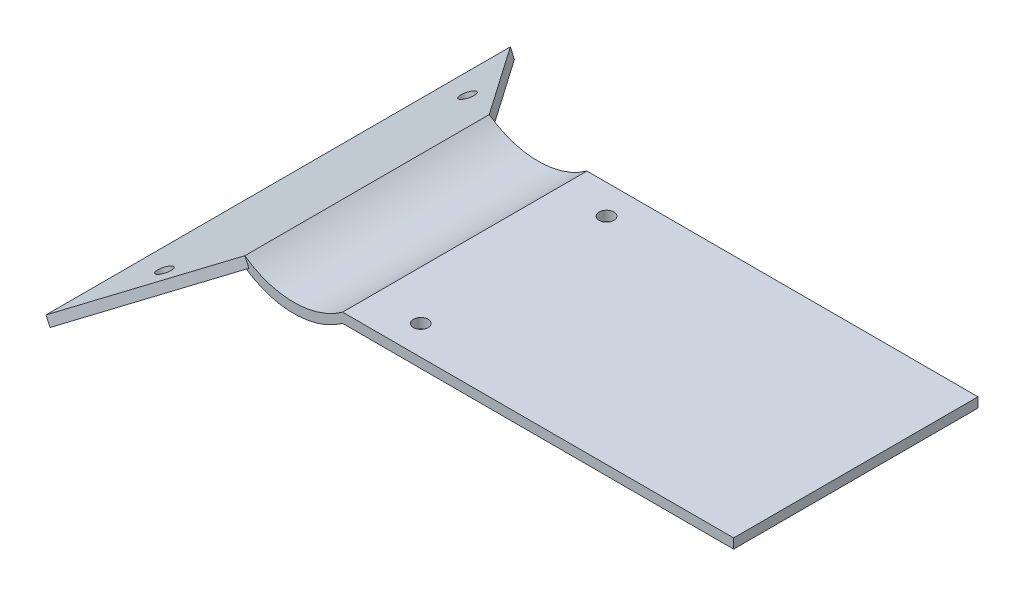
ISO-10303-21;
HEADER;
FILE_DESCRIPTION(('STEP AP214'),'2;1');
FILE_NAME('part.step','',(''),(''),'','','');
FILE_SCHEMA(('AUTOMOTIVE_DESIGN { 1 0 10303 214 1 1 1 1 }'));
ENDSEC;
DATA;
#1=APPLICATION_CONTEXT('core data for automotive mechanical design processes');
#2=APPLICATION_PROTOCOL_DEFINITION('international standard','automotive_design',2000,#1);
#3=PRODUCT_CONTEXT('',#1,'mechanical');
#4=PRODUCT('Part','Part','',(#3));
#5=PRODUCT_RELATED_PRODUCT_CATEGORY('part','',(#4));
#6=PRODUCT_DEFINITION_FORMATION('','',#4);
#7=PRODUCT_DEFINITION_CONTEXT('part definition',#1,'design');
#8=PRODUCT_DEFINITION('design','',#6,#7);
#9=PRODUCT_DEFINITION_SHAPE('','',#8);
#10=(LENGTH_UNIT() NAMED_UNIT(*) SI_UNIT(.MILLI.,.METRE.));
#11=(NAMED_UNIT(*) PLANE_ANGLE_UNIT() SI_UNIT($,.RADIAN.));
#12=(NAMED_UNIT(*) SI_UNIT($,.STERADIAN.) SOLID_ANGLE_UNIT());
#13=UNCERTAINTY_MEASURE_WITH_UNIT(LENGTH_MEASURE(1.E-05),#10,'distance_accuracy_value','');
#14=(GEOMETRIC_REPRESENTATION_CONTEXT(3) GLOBAL_UNCERTAINTY_ASSIGNED_CONTEXT((#13)) GLOBAL_UNIT_ASSIGNED_CONTEXT((#10,
#11,#12)) REPRESENTATION_CONTEXT('',''));
#15=CARTESIAN_POINT('',(0.,0.,0.));
#16=DIRECTION('',(0.,0.,1.));
#17=DIRECTION('',(1.,0.,0.));
#18=AXIS2_PLACEMENT_3D('',#15,#16,#17);
#19=CARTESIAN_POINT('',(-215.409015853351,9.9999999999999,500.));
#20=DIRECTION('',(0.,-1.,0.));
#21=DIRECTION('',(1.,0.,0.));
#22=AXIS2_PLACEMENT_3D('',#19,#20,#21);
#23=PLANE('',#22);
#24=CARTESIAN_POINT('',(-300.,9.99999999999989,60.));
#25=DIRECTION('',(0.,1.,0.));
#26=DIRECTION('',(-1.,0.,0.));
#27=AXIS2_PLACEMENT_3D('',#24,#25,#26);
#28=CIRCLE('',#27,15.);
#29=CARTESIAN_POINT('',(-315.,9.99999999999989,60.));
#30=VERTEX_POINT('',#29);
#31=EDGE_CURVE('E175',#30,#30,#28,.T.);
#32=ORIENTED_EDGE('',*,*,#31,.F.);
#33=EDGE_LOOP('',(#32));
#34=FACE_BOUND('',#33,.T.);
#35=DIRECTION('',(-1.,0.,0.));
#36=VECTOR('',#35,1.);
#37=CARTESIAN_POINT('',(-215.409015853351,9.9999999999999,0.));
#38=LINE('',#37,#36);
#39=CARTESIAN_POINT('',(400.,10.,0.));
#40=VERTEX_POINT('',#39);
#41=CARTESIAN_POINT('',(-400.,9.99999999999988,0.));
#42=VERTEX_POINT('',#41);
#43=EDGE_CURVE('E128',#40,#42,#38,.T.);
#44=ORIENTED_EDGE('',*,*,#43,.T.);
#45=DIRECTION('',(0.,0.,-1.));
#46=VECTOR('',#45,1.);
#47=CARTESIAN_POINT('',(-400.,9.99999999999988,500.));
#48=LINE('',#47,#46);
#49=CARTESIAN_POINT('',(-400.,9.99999999999988,500.));
#50=VERTEX_POINT('',#49);
#51=EDGE_CURVE('E160',#50,#42,#48,.T.);
#52=ORIENTED_EDGE('',*,*,#51,.F.);
#53=DIRECTION('',(-1.,0.,0.));
#54=VECTOR('',#53,1.);
#55=CARTESIAN_POINT('',(-215.409015853351,9.9999999999999,500.));
#56=LINE('',#55,#54);
#57=CARTESIAN_POINT('',(400.,10.,500.));
#58=VERTEX_POINT('',#57);
#59=EDGE_CURVE('E84',#58,#50,#56,.T.);
#60=ORIENTED_EDGE('',*,*,#59,.F.);
#61=DIRECTION('',(0.,0.,-1.));
#62=VECTOR('',#61,1.);
#63=CARTESIAN_POINT('',(400.,10.,500.));
#64=LINE('',#63,#62);
#65=EDGE_CURVE('E123',#58,#40,#64,.T.);
#66=ORIENTED_EDGE('',*,*,#65,.T.);
#67=EDGE_LOOP('',(#44,#52,#60,#66));
#68=FACE_BOUND('',#67,.T.);
#69=CARTESIAN_POINT('',(-300.,9.99999999999989,440.));
#70=DIRECTION('',(0.,1.,0.));
#71=DIRECTION('',(-1.,0.,0.));
#72=AXIS2_PLACEMENT_3D('',#69,#70,#71);
#73=CIRCLE('',#72,15.);
#74=CARTESIAN_POINT('',(-315.,9.99999999999989,440.));
#75=VERTEX_POINT('',#74);
#76=EDGE_CURVE('E165',#75,#75,#73,.F.);
#77=ORIENTED_EDGE('',*,*,#76,.T.);
#78=EDGE_LOOP('',(#77));
#79=FACE_BOUND('',#78,.T.);
#80=ADVANCED_FACE('F33',(#34,#68,#79),#23,.F.);
#81=CARTESIAN_POINT('',(-215.409015853351,-10.,500.));
#82=DIRECTION('',(0.,-1.,0.));
#83=DIRECTION('',(1.,0.,0.));
#84=AXIS2_PLACEMENT_3D('',#81,#82,#83);
#85=PLANE('',#84);
#86=CARTESIAN_POINT('',(-300.,-10.,60.));
#87=DIRECTION('',(0.,-1.,0.));
#88=DIRECTION('',(1.,0.,0.));
#89=AXIS2_PLACEMENT_3D('',#86,#87,#88);
#90=CIRCLE('',#89,15.);
#91=CARTESIAN_POINT('',(-285.,-10.,60.));
#92=VERTEX_POINT('',#91);
#93=EDGE_CURVE('E36',#92,#92,#90,.T.);
#94=ORIENTED_EDGE('',*,*,#93,.F.);
#95=EDGE_LOOP('',(#94));
#96=FACE_BOUND('',#95,.T.);
#97=DIRECTION('',(-1.,0.,0.));
#98=VECTOR('',#97,1.);
#99=CARTESIAN_POINT('',(-215.409015853351,-10.,0.));
#100=LINE('',#99,#98);
#101=CARTESIAN_POINT('',(400.,-9.99999999999993,0.));
#102=VERTEX_POINT('',#101);
#103=CARTESIAN_POINT('',(-400.,-10.,0.));
#104=VERTEX_POINT('',#103);
#105=EDGE_CURVE('E144',#102,#104,#100,.T.);
#106=ORIENTED_EDGE('',*,*,#105,.F.);
#107=DIRECTION('',(0.,0.,-1.));
#108=VECTOR('',#107,1.);
#109=CARTESIAN_POINT('',(400.,-9.99999999999993,500.));
#110=LINE('',#109,#108);
#111=CARTESIAN_POINT('',(400.,-9.99999999999993,500.));
#112=VERTEX_POINT('',#111);
#113=EDGE_CURVE('E75',#112,#102,#110,.T.);
#114=ORIENTED_EDGE('',*,*,#113,.F.);
#115=DIRECTION('',(-1.,0.,0.));
#116=VECTOR('',#115,1.);
#117=CARTESIAN_POINT('',(-215.409015853351,-10.,500.));
#118=LINE('',#117,#116);
#119=CARTESIAN_POINT('',(-400.,-10.,500.));
#120=VERTEX_POINT('',#119);
#121=EDGE_CURVE('E101',#112,#120,#118,.T.);
#122=ORIENTED_EDGE('',*,*,#121,.T.);
#123=DIRECTION('',(0.,0.,-1.));
#124=VECTOR('',#123,1.);
#125=CARTESIAN_POINT('',(-400.,-10.,500.));
#126=LINE('',#125,#124);
#127=EDGE_CURVE('E110',#120,#104,#126,.T.);
#128=ORIENTED_EDGE('',*,*,#127,.T.);
#129=EDGE_LOOP('',(#106,#114,#122,#128));
#130=FACE_BOUND('',#129,.T.);
#131=CARTESIAN_POINT('',(-300.,-10.,440.));
#132=DIRECTION('',(0.,-1.,0.));
#133=DIRECTION('',(1.,0.,0.));
#134=AXIS2_PLACEMENT_3D('',#131,#132,#133);
#135=CIRCLE('',#134,15.);
#136=CARTESIAN_POINT('',(-285.,-10.,440.));
#137=VERTEX_POINT('',#136);
#138=EDGE_CURVE('E162',#137,#137,#135,.F.);
#139=ORIENTED_EDGE('',*,*,#138,.T.);
#140=EDGE_LOOP('',(#139));
#141=FACE_BOUND('',#140,.T.);
#142=ADVANCED_FACE('F120',(#96,#130,#141),#85,.T.);
#143=CARTESIAN_POINT('',(-215.409015853351,-969.886426697641,0.));
#144=DIRECTION('',(0.,0.,1.));
#145=DIRECTION('',(1.,0.,0.));
#146=AXIS2_PLACEMENT_3D('',#143,#144,#145);
#147=PLANE('',#146);
#148=DIRECTION('',(-0.416666666666667,0.909059342886309,0.));
#149=VECTOR('',#148,1.);
#150=CARTESIAN_POINT('',(-773.478535243929,-91.5145201910597,0.));
#151=LINE('',#150,#149);
#152=CARTESIAN_POINT('',(-774.236374053209,-89.8611111111113,0.));
#153=VERTEX_POINT('',#152);
#154=CARTESIAN_POINT('',(-781.811868577262,-73.3333333333335,0.));
#155=VERTEX_POINT('',#154);
#156=EDGE_CURVE('E11',#153,#155,#151,.T.);
#157=ORIENTED_EDGE('',*,*,#156,.F.);
#158=DIRECTION('',(-0.90905934288631,-0.416666666666667,0.));
#159=VECTOR('',#158,1.);
#160=CARTESIAN_POINT('',(-645.759002392385,-30.9736043593051,0.));
#161=LINE('',#160,#159);
#162=CARTESIAN_POINT('',(-818.174242292714,-110.,0.));
#163=VERTEX_POINT('',#162);
#164=EDGE_CURVE('E138',#153,#163,#161,.T.);
#165=ORIENTED_EDGE('',*,*,#164,.T.);
#166=DIRECTION('',(-0.704154339142587,-0.710046946804693,0.));
#167=VECTOR('',#166,1.);
#168=CARTESIAN_POINT('',(-949.231435355701,-242.153925096134,0.));
#169=LINE('',#168,#167);
#170=EDGE_CURVE('E135',#155,#163,#169,.T.);
#171=ORIENTED_EDGE('',*,*,#170,.F.);
#172=EDGE_LOOP('',(#157,#165,#171));
#173=FACE_BOUND('',#172,.T.);
#174=ADVANCED_FACE('F260',(#173),#147,.F.);
#175=DIRECTION('',(-0.909059342886309,-0.416666666666667,0.));
#176=VECTOR('',#175,1.);
#177=CARTESIAN_POINT('',(-1368.37615592177,-364.185397571579,0.));
#178=LINE('',#177,#176);
#179=CARTESIAN_POINT('',(-591.666666666667,-8.18118685772623,0.));
#180=VERTEX_POINT('',#179);
#181=CARTESIAN_POINT('',(-598.299201498949,-11.2212042138465,0.));
#182=VERTEX_POINT('',#181);
#183=EDGE_CURVE('E189',#180,#182,#178,.T.);
#184=ORIENTED_EDGE('',*,*,#183,.F.);
#185=DIRECTION('',(-0.416666666666667,0.909059342886309,0.));
#186=VECTOR('',#185,1.);
#187=CARTESIAN_POINT('',(-591.666666666667,-8.18118685772623,0.));
#188=LINE('',#187,#186);
#189=CARTESIAN_POINT('',(-600.,9.9999999999999,0.));
#190=VERTEX_POINT('',#189);
#191=EDGE_CURVE('E197',#180,#190,#188,.T.);
#192=ORIENTED_EDGE('',*,*,#191,.T.);
#193=CARTESIAN_POINT('',(-500.,147.477270848675,0.));
#194=DIRECTION('',(0.,0.,1.));
#195=DIRECTION('',(1.,0.,0.));
#196=AXIS2_PLACEMENT_3D('',#193,#194,#195);
#197=CIRCLE('',#196,170.);
#198=EDGE_CURVE('E131',#190,#42,#197,.T.);
#199=ORIENTED_EDGE('',*,*,#198,.T.);
#200=ORIENTED_EDGE('',*,*,#43,.F.);
#201=DIRECTION('',(0.,1.,0.));
#202=VECTOR('',#201,1.);
#203=CARTESIAN_POINT('',(400.,-969.886426697641,0.));
#204=LINE('',#203,#202);
#205=EDGE_CURVE('E78',#102,#40,#204,.T.);
#206=ORIENTED_EDGE('',*,*,#205,.F.);
#207=ORIENTED_EDGE('',*,*,#105,.T.);
#208=CARTESIAN_POINT('',(-500.,127.477270848675,0.));
#209=DIRECTION('',(0.,0.,1.));
#210=DIRECTION('',(1.,0.,0.));
#211=AXIS2_PLACEMENT_3D('',#208,#209,#210);
#212=CIRCLE('',#211,170.);
#213=EDGE_CURVE('E114',#182,#104,#212,.T.);
#214=ORIENTED_EDGE('',*,*,#213,.F.);
#215=EDGE_LOOP('',(#184,#192,#199,#200,#206,#207,#214));
#216=FACE_BOUND('',#215,.T.);
#217=ADVANCED_FACE('F308',(#216),#147,.F.);
#218=CARTESIAN_POINT('',(-215.409015853351,-969.886426697641,500.));
#219=DIRECTION('',(0.,0.,1.));
#220=DIRECTION('',(1.,0.,0.));
#221=AXIS2_PLACEMENT_3D('',#218,#219,#220);
#222=PLANE('',#221);
#223=DIRECTION('',(-0.90905934288631,-0.416666666666667,0.));
#224=VECTOR('',#223,1.);
#225=CARTESIAN_POINT('',(-645.759002392385,-30.9736043593051,500.));
#226=LINE('',#225,#224);
#227=CARTESIAN_POINT('',(-774.236374053209,-89.8611111111113,500.));
#228=VERTEX_POINT('',#227);
#229=CARTESIAN_POINT('',(-818.174242292714,-110.,500.));
#230=VERTEX_POINT('',#229);
#231=EDGE_CURVE('E237',#228,#230,#226,.T.);
#232=ORIENTED_EDGE('',*,*,#231,.F.);
#233=DIRECTION('',(-0.416666666666667,0.909059342886309,0.));
#234=VECTOR('',#233,1.);
#235=CARTESIAN_POINT('',(-773.478535243929,-91.5145201910596,500.));
#236=LINE('',#235,#234);
#237=CARTESIAN_POINT('',(-781.811868577262,-73.3333333333335,500.));
#238=VERTEX_POINT('',#237);
#239=EDGE_CURVE('E161',#228,#238,#236,.T.);
#240=ORIENTED_EDGE('',*,*,#239,.T.);
#241=DIRECTION('',(-0.704154339142587,-0.710046946804693,0.));
#242=VECTOR('',#241,1.);
#243=CARTESIAN_POINT('',(-949.231435355701,-242.153925096134,500.));
#244=LINE('',#243,#242);
#245=EDGE_CURVE('E235',#238,#230,#244,.T.);
#246=ORIENTED_EDGE('',*,*,#245,.T.);
#247=EDGE_LOOP('',(#232,#240,#246));
#248=FACE_BOUND('',#247,.T.);
#249=ADVANCED_FACE('F251',(#248),#222,.T.);
#250=CARTESIAN_POINT('',(-500.,147.477270848675,500.));
#251=DIRECTION('',(0.,0.,-1.));
#252=DIRECTION('',(-1.,0.,0.));
#253=AXIS2_PLACEMENT_3D('',#250,#251,#252);
#254=CYLINDRICAL_SURFACE('',#253,170.);
#255=ORIENTED_EDGE('',*,*,#198,.F.);
#256=DIRECTION('',(0.,0.,-1.));
#257=VECTOR('',#256,1.);
#258=CARTESIAN_POINT('',(-600.,9.9999999999999,500.));
#259=LINE('',#258,#257);
#260=CARTESIAN_POINT('',(-600.,9.99999999999995,500.));
#261=VERTEX_POINT('',#260);
#262=EDGE_CURVE('E157',#261,#190,#259,.T.);
#263=ORIENTED_EDGE('',*,*,#262,.F.);
#264=CARTESIAN_POINT('',(-500.,147.477270848675,500.));
#265=DIRECTION('',(0.,0.,1.));
#266=DIRECTION('',(1.,0.,0.));
#267=AXIS2_PLACEMENT_3D('',#264,#265,#266);
#268=CIRCLE('',#267,170.);
#269=EDGE_CURVE('E232',#261,#50,#268,.T.);
#270=ORIENTED_EDGE('',*,*,#269,.T.);
#271=ORIENTED_EDGE('',*,*,#51,.T.);
#272=EDGE_LOOP('',(#255,#263,#270,#271));
#273=FACE_BOUND('',#272,.T.);
#274=ADVANCED_FACE('F382',(#273),#254,.F.);
#275=CARTESIAN_POINT('',(-653.334496916438,-14.4458265815273,500.));
#276=DIRECTION('',(0.416666666666667,-0.909059342886309,0.));
#277=DIRECTION('',(0.909059342886309,0.416666666666667,0.));
#278=AXIS2_PLACEMENT_3D('',#275,#276,#277);
#279=PLANE('',#278);
#280=ORIENTED_EDGE('',*,*,#262,.T.);
#281=DIRECTION('',(-0.603946154764153,-0.276818266179133,-0.74740931868366));
#282=VECTOR('',#281,1.);
#283=CARTESIAN_POINT('',(-813.752809149338,-87.973439441378,-264.52828649172));
#284=LINE('',#283,#282);
#285=CARTESIAN_POINT('',(-781.811868577262,-73.3333333333335,-225.));
#286=VERTEX_POINT('',#285);
#287=EDGE_CURVE('E168',#190,#286,#284,.T.);
#288=ORIENTED_EDGE('',*,*,#287,.T.);
#289=DIRECTION('',(0.,0.,1.));
#290=VECTOR('',#289,1.);
#291=CARTESIAN_POINT('',(-781.811868577262,-73.3333333333335,285.937358889559));
#292=LINE('',#291,#290);
#293=EDGE_CURVE('E182',#286,#155,#292,.T.);
#294=ORIENTED_EDGE('',*,*,#293,.T.);
#295=DIRECTION('',(0.,0.,-1.));
#296=VECTOR('',#295,1.);
#297=CARTESIAN_POINT('',(-781.811868577262,-73.3333333333335,500.));
#298=LINE('',#297,#296);
#299=EDGE_CURVE('E154',#238,#155,#298,.T.);
#300=ORIENTED_EDGE('',*,*,#299,.F.);
#301=DIRECTION('',(0.,0.,-1.));
#302=VECTOR('',#301,1.);
#303=CARTESIAN_POINT('',(-781.811868577262,-73.3333333333336,285.937358889559));
#304=LINE('',#303,#302);
#305=CARTESIAN_POINT('',(-781.811868577262,-73.3333333333335,725.));
#306=VERTEX_POINT('',#305);
#307=EDGE_CURVE('E220',#306,#238,#304,.T.);
#308=ORIENTED_EDGE('',*,*,#307,.F.);
#309=DIRECTION('',(-0.603946154764153,-0.276818266179133,0.74740931868366));
#310=VECTOR('',#309,1.);
#311=CARTESIAN_POINT('',(-846.19669623512,-102.844070706023,804.678990906262));
#312=LINE('',#311,#310);
#313=EDGE_CURVE('E199',#261,#306,#312,.T.);
#314=ORIENTED_EDGE('',*,*,#313,.F.);
#315=EDGE_LOOP('',(#280,#288,#294,#300,#308,#314));
#316=FACE_BOUND('',#315,.T.);
#317=CARTESIAN_POINT('',(-704.541824431926,-37.9166666666667,560.));
#318=DIRECTION('',(-0.416666666666667,0.909059342886309,0.));
#319=DIRECTION('',(-0.909059342886309,-0.416666666666667,0.));
#320=AXIS2_PLACEMENT_3D('',#317,#318,#319);
#321=CIRCLE('',#320,15.0000000000001);
#322=CARTESIAN_POINT('',(-718.17771457522,-44.1666666666668,560.));
#323=VERTEX_POINT('',#322);
#324=EDGE_CURVE('E208',#323,#323,#321,.F.);
#325=ORIENTED_EDGE('',*,*,#324,.T.);
#326=EDGE_LOOP('',(#325));
#327=FACE_BOUND('',#326,.T.);
#328=CARTESIAN_POINT('',(-704.541824431926,-37.9166666666668,-60.));
#329=DIRECTION('',(-0.416666666666667,0.909059342886309,0.));
#330=DIRECTION('',(-0.909059342886309,-0.416666666666667,0.));
#331=AXIS2_PLACEMENT_3D('',#328,#329,#330);
#332=CIRCLE('',#331,15.0000000000001);
#333=CARTESIAN_POINT('',(-718.177714575221,-44.1666666666669,-60.));
#334=VERTEX_POINT('',#333);
#335=EDGE_CURVE('E164',#334,#334,#332,.T.);
#336=ORIENTED_EDGE('',*,*,#335,.F.);
#337=EDGE_LOOP('',(#336));
#338=FACE_BOUND('',#337,.T.);
#339=ADVANCED_FACE('F386',(#316,#327,#338),#279,.F.);
#340=CARTESIAN_POINT('',(-949.231435355701,-242.153925096134,500.));
#341=DIRECTION('',(0.710046946804693,-0.704154339142587,0.));
#342=DIRECTION('',(0.704154339142587,0.710046946804693,0.));
#343=AXIS2_PLACEMENT_3D('',#340,#341,#342);
#344=PLANE('',#343);
#345=ORIENTED_EDGE('',*,*,#170,.T.);
#346=DIRECTION('',(0.,0.,-1.));
#347=VECTOR('',#346,1.);
#348=CARTESIAN_POINT('',(-818.174242292714,-110.,500.));
#349=LINE('',#348,#347);
#350=EDGE_CURVE('E151',#230,#163,#349,.T.);
#351=ORIENTED_EDGE('',*,*,#350,.F.);
#352=ORIENTED_EDGE('',*,*,#245,.F.);
#353=ORIENTED_EDGE('',*,*,#299,.T.);
#354=EDGE_LOOP('',(#345,#351,#352,#353));
#355=FACE_BOUND('',#354,.T.);
#356=ADVANCED_FACE('F255',(#355),#344,.F.);
#357=CARTESIAN_POINT('',(-645.759002392385,-30.9736043593051,500.));
#358=DIRECTION('',(0.416666666666667,-0.90905934288631,0.));
#359=DIRECTION('',(0.90905934288631,0.416666666666667,0.));
#360=AXIS2_PLACEMENT_3D('',#357,#358,#359);
#361=PLANE('',#360);
#362=CARTESIAN_POINT('',(-600.,-10.,0.));
#363=VERTEX_POINT('',#362);
#364=EDGE_CURVE('E139',#363,#153,#161,.T.);
#365=ORIENTED_EDGE('',*,*,#364,.F.);
#366=DIRECTION('',(0.,0.,-1.));
#367=VECTOR('',#366,1.);
#368=CARTESIAN_POINT('',(-600.,-10.,500.));
#369=LINE('',#368,#367);
#370=CARTESIAN_POINT('',(-600.,-10.,500.));
#371=VERTEX_POINT('',#370);
#372=EDGE_CURVE('E118',#371,#363,#369,.T.);
#373=ORIENTED_EDGE('',*,*,#372,.F.);
#374=EDGE_CURVE('E107',#371,#228,#226,.T.);
#375=ORIENTED_EDGE('',*,*,#374,.T.);
#376=ORIENTED_EDGE('',*,*,#231,.T.);
#377=ORIENTED_EDGE('',*,*,#350,.T.);
#378=ORIENTED_EDGE('',*,*,#164,.F.);
#379=EDGE_LOOP('',(#365,#373,#375,#376,#377,#378));
#380=FACE_BOUND('',#379,.T.);
#381=ADVANCED_FACE('F245',(#380),#361,.T.);
#382=CARTESIAN_POINT('',(-500.,127.477270848675,500.));
#383=DIRECTION('',(0.,0.,-1.));
#384=DIRECTION('',(-1.,0.,0.));
#385=AXIS2_PLACEMENT_3D('',#382,#383,#384);
#386=CYLINDRICAL_SURFACE('',#385,170.);
#387=EDGE_CURVE('E142',#363,#182,#212,.T.);
#388=ORIENTED_EDGE('',*,*,#387,.T.);
#389=ORIENTED_EDGE('',*,*,#213,.T.);
#390=ORIENTED_EDGE('',*,*,#127,.F.);
#391=CARTESIAN_POINT('',(-500.,127.477270848675,500.));
#392=DIRECTION('',(0.,0.,1.));
#393=DIRECTION('',(1.,0.,0.));
#394=AXIS2_PLACEMENT_3D('',#391,#392,#393);
#395=CIRCLE('',#394,170.);
#396=CARTESIAN_POINT('',(-598.299201498949,-11.2212042138465,500.));
#397=VERTEX_POINT('',#396);
#398=EDGE_CURVE('E96',#397,#120,#395,.T.);
#399=ORIENTED_EDGE('',*,*,#398,.F.);
#400=EDGE_CURVE('E106',#371,#397,#395,.T.);
#401=ORIENTED_EDGE('',*,*,#400,.F.);
#402=ORIENTED_EDGE('',*,*,#372,.T.);
#403=EDGE_LOOP('',(#388,#389,#390,#399,#401,#402));
#404=FACE_BOUND('',#403,.T.);
#405=ADVANCED_FACE('F112',(#404),#386,.T.);
#406=CARTESIAN_POINT('',(400.,-969.886426697641,500.));
#407=DIRECTION('',(-1.,0.,0.));
#408=DIRECTION('',(0.,0.,1.));
#409=AXIS2_PLACEMENT_3D('',#406,#407,#408);
#410=PLANE('',#409);
#411=ORIENTED_EDGE('',*,*,#205,.T.);
#412=ORIENTED_EDGE('',*,*,#65,.F.);
#413=DIRECTION('',(0.,1.,0.));
#414=VECTOR('',#413,1.);
#415=CARTESIAN_POINT('',(400.,-969.886426697641,500.));
#416=LINE('',#415,#414);
#417=EDGE_CURVE('E52',#112,#58,#416,.T.);
#418=ORIENTED_EDGE('',*,*,#417,.F.);
#419=ORIENTED_EDGE('',*,*,#113,.T.);
#420=EDGE_LOOP('',(#411,#412,#418,#419));
#421=FACE_BOUND('',#420,.T.);
#422=ADVANCED_FACE('F312',(#421),#410,.F.);
#423=DIRECTION('',(-0.416666666666667,0.909059342886309,0.));
#424=VECTOR('',#423,1.);
#425=CARTESIAN_POINT('',(-591.666666666667,-8.18118685772623,500.));
#426=LINE('',#425,#424);
#427=CARTESIAN_POINT('',(-591.666666666667,-8.18118685772623,500.));
#428=VERTEX_POINT('',#427);
#429=EDGE_CURVE('E217',#428,#261,#426,.T.);
#430=ORIENTED_EDGE('',*,*,#429,.F.);
#431=DIRECTION('',(0.909059342886309,0.416666666666667,0.));
#432=VECTOR('',#431,1.);
#433=CARTESIAN_POINT('',(-1368.37615592177,-364.185397571579,500.));
#434=LINE('',#433,#432);
#435=EDGE_CURVE('E42',#397,#428,#434,.T.);
#436=ORIENTED_EDGE('',*,*,#435,.F.);
#437=ORIENTED_EDGE('',*,*,#398,.T.);
#438=ORIENTED_EDGE('',*,*,#121,.F.);
#439=ORIENTED_EDGE('',*,*,#417,.T.);
#440=ORIENTED_EDGE('',*,*,#59,.T.);
#441=ORIENTED_EDGE('',*,*,#269,.F.);
#442=EDGE_LOOP('',(#430,#436,#437,#438,#439,#440,#441));
#443=FACE_BOUND('',#442,.T.);
#444=ADVANCED_FACE('F99',(#443),#222,.T.);
#445=CARTESIAN_POINT('',(-837.863362901787,-121.025257563749,804.678990906262));
#446=DIRECTION('',(-0.679439424109672,-0.311420549451525,-0.66436383882992));
#447=DIRECTION('',(-0.699130042430675,0.,0.71499453408462));
#448=AXIS2_PLACEMENT_3D('',#445,#446,#447);
#449=PLANE('',#448);
#450=ORIENTED_EDGE('',*,*,#313,.T.);
#451=DIRECTION('',(-0.416666666666667,0.909059342886309,0.));
#452=VECTOR('',#451,1.);
#453=CARTESIAN_POINT('',(-773.478535243929,-91.5145201910597,725.));
#454=LINE('',#453,#452);
#455=CARTESIAN_POINT('',(-773.478535243929,-91.5145201910597,725.));
#456=VERTEX_POINT('',#455);
#457=EDGE_CURVE('E132',#456,#306,#454,.T.);
#458=ORIENTED_EDGE('',*,*,#457,.F.);
#459=DIRECTION('',(-0.603946154764153,-0.276818266179133,0.74740931868366));
#460=VECTOR('',#459,1.);
#461=CARTESIAN_POINT('',(-837.863362901787,-121.025257563749,804.678990906262));
#462=LINE('',#461,#460);
#463=EDGE_CURVE('E204',#428,#456,#462,.T.);
#464=ORIENTED_EDGE('',*,*,#463,.F.);
#465=ORIENTED_EDGE('',*,*,#429,.T.);
#466=EDGE_LOOP('',(#450,#458,#464,#465));
#467=FACE_BOUND('',#466,.T.);
#468=ADVANCED_FACE('F319',(#467),#449,.F.);
#469=CARTESIAN_POINT('',(-773.478535243929,-91.5145201910598,285.937358889559));
#470=DIRECTION('',(0.909059342886309,0.416666666666667,0.));
#471=DIRECTION('',(-0.416666666666667,0.909059342886309,0.));
#472=AXIS2_PLACEMENT_3D('',#469,#470,#471);
#473=PLANE('',#472);
#474=ORIENTED_EDGE('',*,*,#307,.T.);
#475=ORIENTED_EDGE('',*,*,#239,.F.);
#476=CARTESIAN_POINT('',(-773.478535243929,-91.5145201910596,500.));
#477=VERTEX_POINT('',#476);
#478=EDGE_CURVE('E226',#477,#228,#236,.T.);
#479=ORIENTED_EDGE('',*,*,#478,.F.);
#480=DIRECTION('',(0.,0.,-1.));
#481=VECTOR('',#480,1.);
#482=CARTESIAN_POINT('',(-773.478535243929,-91.5145201910598,285.937358889559));
#483=LINE('',#482,#481);
#484=EDGE_CURVE('E211',#456,#477,#483,.T.);
#485=ORIENTED_EDGE('',*,*,#484,.F.);
#486=ORIENTED_EDGE('',*,*,#457,.T.);
#487=EDGE_LOOP('',(#474,#475,#479,#485,#486));
#488=FACE_BOUND('',#487,.T.);
#489=ADVANCED_FACE('F368',(#488),#473,.F.);
#490=CARTESIAN_POINT('',(-1368.37615592177,-364.185397571579,500.));
#491=DIRECTION('',(0.,0.,1.));
#492=DIRECTION('',(1.,0.,0.));
#493=AXIS2_PLACEMENT_3D('',#490,#491,#492);
#494=PLANE('',#493);
#495=ORIENTED_EDGE('',*,*,#374,.F.);
#496=ORIENTED_EDGE('',*,*,#400,.T.);
#497=EDGE_CURVE('E207',#477,#397,#434,.T.);
#498=ORIENTED_EDGE('',*,*,#497,.F.);
#499=ORIENTED_EDGE('',*,*,#478,.T.);
#500=EDGE_LOOP('',(#495,#496,#498,#499));
#501=FACE_BOUND('',#500,.T.);
#502=ADVANCED_FACE('F296',(#501),#494,.F.);
#503=CARTESIAN_POINT('',(-696.208491098592,-56.0978535243929,560.));
#504=DIRECTION('',(-0.416666666666667,0.909059342886309,0.));
#505=DIRECTION('',(-0.909059342886309,-0.416666666666667,0.));
#506=AXIS2_PLACEMENT_3D('',#503,#504,#505);
#507=CYLINDRICAL_SURFACE('',#506,15.0000000000001);
#508=CARTESIAN_POINT('',(-696.208491098592,-56.0978535243929,560.));
#509=DIRECTION('',(-0.416666666666667,0.909059342886309,0.));
#510=DIRECTION('',(-0.909059342886309,-0.416666666666667,0.));
#511=AXIS2_PLACEMENT_3D('',#508,#509,#510);
#512=CIRCLE('',#511,15.0000000000001);
#513=CARTESIAN_POINT('',(-709.844381241887,-62.3478535243929,560.));
#514=VERTEX_POINT('',#513);
#515=EDGE_CURVE('E214',#514,#514,#512,.F.);
#516=ORIENTED_EDGE('',*,*,#515,.T.);
#517=EDGE_LOOP('',(#516));
#518=FACE_BOUND('',#517,.T.);
#519=ORIENTED_EDGE('',*,*,#324,.F.);
#520=EDGE_LOOP('',(#519));
#521=FACE_BOUND('',#520,.T.);
#522=ADVANCED_FACE('F363',(#518,#521),#507,.F.);
#523=CARTESIAN_POINT('',(-1368.37615592177,-364.185397571579,285.937358889559));
#524=DIRECTION('',(-0.416666666666667,0.909059342886309,0.));
#525=DIRECTION('',(-0.909059342886309,-0.416666666666667,0.));
#526=AXIS2_PLACEMENT_3D('',#523,#524,#525);
#527=PLANE('',#526);
#528=ORIENTED_EDGE('',*,*,#463,.T.);
#529=ORIENTED_EDGE('',*,*,#484,.T.);
#530=ORIENTED_EDGE('',*,*,#497,.T.);
#531=ORIENTED_EDGE('',*,*,#435,.T.);
#532=EDGE_LOOP('',(#528,#529,#530,#531));
#533=FACE_BOUND('',#532,.T.);
#534=ORIENTED_EDGE('',*,*,#515,.F.);
#535=EDGE_LOOP('',(#534));
#536=FACE_BOUND('',#535,.T.);
#537=ADVANCED_FACE('F356',(#533,#536),#527,.F.);
#538=CARTESIAN_POINT('',(-805.419475816004,-106.154626299104,-264.52828649172));
#539=DIRECTION('',(0.679439424109672,0.311420549451525,-0.66436383882992));
#540=DIRECTION('',(-0.699130042430675,0.,-0.71499453408462));
#541=AXIS2_PLACEMENT_3D('',#538,#539,#540);
#542=PLANE('',#541);
#543=ORIENTED_EDGE('',*,*,#287,.F.);
#544=ORIENTED_EDGE('',*,*,#191,.F.);
#545=DIRECTION('',(-0.603946154764153,-0.276818266179133,-0.74740931868366));
#546=VECTOR('',#545,1.);
#547=CARTESIAN_POINT('',(-805.419475816004,-106.154626299104,-264.52828649172));
#548=LINE('',#547,#546);
#549=CARTESIAN_POINT('',(-773.478535243929,-91.5145201910596,-225.));
#550=VERTEX_POINT('',#549);
#551=EDGE_CURVE('E181',#180,#550,#548,.T.);
#552=ORIENTED_EDGE('',*,*,#551,.T.);
#553=DIRECTION('',(-0.416666666666667,0.909059342886309,0.));
#554=VECTOR('',#553,1.);
#555=CARTESIAN_POINT('',(-773.478535243929,-91.5145201910596,-225.));
#556=LINE('',#555,#554);
#557=EDGE_CURVE('E191',#550,#286,#556,.T.);
#558=ORIENTED_EDGE('',*,*,#557,.T.);
#559=EDGE_LOOP('',(#543,#544,#552,#558));
#560=FACE_BOUND('',#559,.T.);
#561=ADVANCED_FACE('F351',(#560),#542,.T.);
#562=CARTESIAN_POINT('',(-1368.37615592177,-364.185397571579,0.));
#563=DIRECTION('',(0.,0.,-1.));
#564=DIRECTION('',(-1.,0.,0.));
#565=AXIS2_PLACEMENT_3D('',#562,#563,#564);
#566=PLANE('',#565);
#567=ORIENTED_EDGE('',*,*,#387,.F.);
#568=ORIENTED_EDGE('',*,*,#364,.T.);
#569=CARTESIAN_POINT('',(-773.478535243929,-91.5145201910597,0.));
#570=VERTEX_POINT('',#569);
#571=EDGE_CURVE('E44',#570,#153,#151,.T.);
#572=ORIENTED_EDGE('',*,*,#571,.F.);
#573=EDGE_CURVE('E188',#182,#570,#178,.T.);
#574=ORIENTED_EDGE('',*,*,#573,.F.);
#575=EDGE_LOOP('',(#567,#568,#572,#574));
#576=FACE_BOUND('',#575,.T.);
#577=ADVANCED_FACE('F299',(#576),#566,.F.);
#578=CARTESIAN_POINT('',(-696.208491098593,-56.097853524393,-60.));
#579=DIRECTION('',(-0.416666666666667,0.909059342886309,0.));
#580=DIRECTION('',(-0.909059342886309,-0.416666666666667,0.));
#581=AXIS2_PLACEMENT_3D('',#578,#579,#580);
#582=CYLINDRICAL_SURFACE('',#581,15.0000000000001);
#583=CARTESIAN_POINT('',(-696.208491098593,-56.097853524393,-60.));
#584=DIRECTION('',(-0.416666666666667,0.909059342886309,0.));
#585=DIRECTION('',(-0.909059342886309,-0.416666666666667,0.));
#586=AXIS2_PLACEMENT_3D('',#583,#584,#585);
#587=CIRCLE('',#586,15.0000000000001);
#588=CARTESIAN_POINT('',(-709.844381241887,-62.347853524393,-60.));
#589=VERTEX_POINT('',#588);
#590=EDGE_CURVE('E178',#589,#589,#587,.T.);
#591=ORIENTED_EDGE('',*,*,#590,.F.);
#592=EDGE_LOOP('',(#591));
#593=FACE_BOUND('',#592,.T.);
#594=ORIENTED_EDGE('',*,*,#335,.T.);
#595=EDGE_LOOP('',(#594));
#596=FACE_BOUND('',#595,.T.);
#597=ADVANCED_FACE('F350',(#593,#596),#582,.F.);
#598=CARTESIAN_POINT('',(-773.478535243929,-91.5145201910597,285.937358889559));
#599=DIRECTION('',(-0.909059342886309,-0.416666666666667,0.));
#600=DIRECTION('',(0.416666666666667,-0.909059342886309,0.));
#601=AXIS2_PLACEMENT_3D('',#598,#599,#600);
#602=PLANE('',#601);
#603=ORIENTED_EDGE('',*,*,#293,.F.);
#604=ORIENTED_EDGE('',*,*,#557,.F.);
#605=DIRECTION('',(0.,0.,1.));
#606=VECTOR('',#605,1.);
#607=CARTESIAN_POINT('',(-773.478535243929,-91.5145201910597,285.937358889559));
#608=LINE('',#607,#606);
#609=EDGE_CURVE('E185',#550,#570,#608,.T.);
#610=ORIENTED_EDGE('',*,*,#609,.T.);
#611=ORIENTED_EDGE('',*,*,#571,.T.);
#612=ORIENTED_EDGE('',*,*,#156,.T.);
#613=EDGE_LOOP('',(#603,#604,#610,#611,#612));
#614=FACE_BOUND('',#613,.T.);
#615=ADVANCED_FACE('F346',(#614),#602,.T.);
#616=CARTESIAN_POINT('',(-1368.37615592177,-364.185397571579,285.937358889559));
#617=DIRECTION('',(-0.416666666666667,0.909059342886309,0.));
#618=DIRECTION('',(-0.909059342886309,-0.416666666666667,0.));
#619=AXIS2_PLACEMENT_3D('',#616,#617,#618);
#620=PLANE('',#619);
#621=ORIENTED_EDGE('',*,*,#590,.T.);
#622=EDGE_LOOP('',(#621));
#623=FACE_BOUND('',#622,.T.);
#624=ORIENTED_EDGE('',*,*,#551,.F.);
#625=ORIENTED_EDGE('',*,*,#183,.T.);
#626=ORIENTED_EDGE('',*,*,#573,.T.);
#627=ORIENTED_EDGE('',*,*,#609,.F.);
#628=EDGE_LOOP('',(#624,#625,#626,#627));
#629=FACE_BOUND('',#628,.T.);
#630=ADVANCED_FACE('F306',(#623,#629),#620,.F.);
#631=CARTESIAN_POINT('',(-300.,-110.,440.));
#632=DIRECTION('',(0.,1.,0.));
#633=DIRECTION('',(-1.,0.,0.));
#634=AXIS2_PLACEMENT_3D('',#631,#632,#633);
#635=CYLINDRICAL_SURFACE('',#634,15.);
#636=ORIENTED_EDGE('',*,*,#138,.F.);
#637=EDGE_LOOP('',(#636));
#638=FACE_BOUND('',#637,.T.);
#639=ORIENTED_EDGE('',*,*,#76,.F.);
#640=EDGE_LOOP('',(#639));
#641=FACE_BOUND('',#640,.T.);
#642=ADVANCED_FACE('F335',(#638,#641),#635,.F.);
#643=CARTESIAN_POINT('',(-300.,-110.,60.));
#644=DIRECTION('',(0.,1.,0.));
#645=DIRECTION('',(-1.,0.,0.));
#646=AXIS2_PLACEMENT_3D('',#643,#644,#645);
#647=CYLINDRICAL_SURFACE('',#646,15.);
#648=ORIENTED_EDGE('',*,*,#93,.T.);
#649=EDGE_LOOP('',(#648));
#650=FACE_BOUND('',#649,.T.);
#651=ORIENTED_EDGE('',*,*,#31,.T.);
#652=EDGE_LOOP('',(#651));
#653=FACE_BOUND('',#652,.T.);
#654=ADVANCED_FACE('F333',(#650,#653),#647,.F.);
#655=CLOSED_SHELL('',(#80,#142,#174,#217,#249,#274,#339,#356,#381,#405,#422,#444,#468,#489,#502,
#522,#537,#561,#577,#597,#615,#630,#642,#654));
#656=MANIFOLD_SOLID_BREP('B2',#655);
#657=ADVANCED_BREP_SHAPE_REPRESENTATION('',(#18,#656),#14);
#658=SHAPE_DEFINITION_REPRESENTATION(#9,#657);
ENDSEC;
END-ISO-10303-21;
